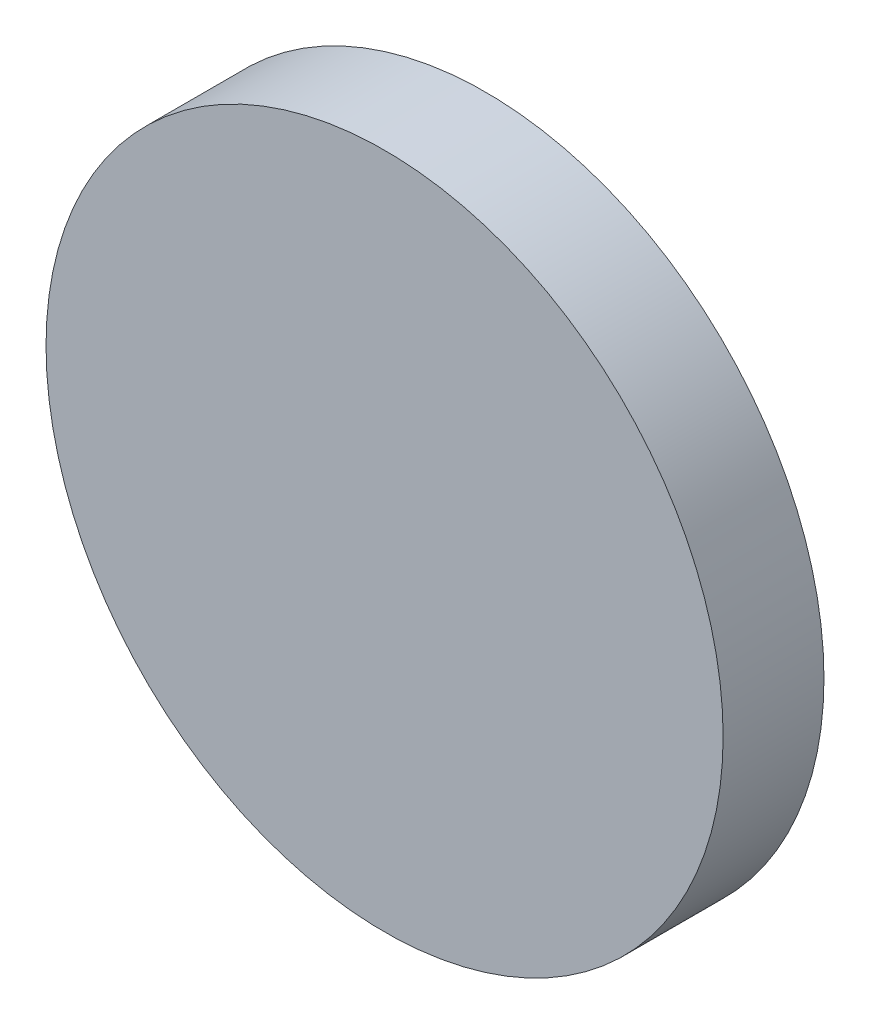
ISO-10303-21;
HEADER;
FILE_DESCRIPTION(('STEP AP214'),'2;1');
FILE_NAME('part.step','',(''),(''),'','','');
FILE_SCHEMA(('AUTOMOTIVE_DESIGN { 1 0 10303 214 1 1 1 1 }'));
ENDSEC;
DATA;
#1=APPLICATION_CONTEXT('core data for automotive mechanical design processes');
#2=APPLICATION_PROTOCOL_DEFINITION('international standard','automotive_design',2000,#1);
#3=PRODUCT_CONTEXT('',#1,'mechanical');
#4=PRODUCT('Part','Part','',(#3));
#5=PRODUCT_RELATED_PRODUCT_CATEGORY('part','',(#4));
#6=PRODUCT_DEFINITION_FORMATION('','',#4);
#7=PRODUCT_DEFINITION_CONTEXT('part definition',#1,'design');
#8=PRODUCT_DEFINITION('design','',#6,#7);
#9=PRODUCT_DEFINITION_SHAPE('','',#8);
#10=(LENGTH_UNIT() NAMED_UNIT(*) SI_UNIT(.MILLI.,.METRE.));
#11=(NAMED_UNIT(*) PLANE_ANGLE_UNIT() SI_UNIT($,.RADIAN.));
#12=(NAMED_UNIT(*) SI_UNIT($,.STERADIAN.) SOLID_ANGLE_UNIT());
#13=UNCERTAINTY_MEASURE_WITH_UNIT(LENGTH_MEASURE(1.E-05),#10,'distance_accuracy_value','');
#14=(GEOMETRIC_REPRESENTATION_CONTEXT(3) GLOBAL_UNCERTAINTY_ASSIGNED_CONTEXT((#13)) GLOBAL_UNIT_ASSIGNED_CONTEXT((#10,
#11,#12)) REPRESENTATION_CONTEXT('',''));
#15=CARTESIAN_POINT('',(0.,0.,0.));
#16=DIRECTION('',(0.,0.,1.));
#17=DIRECTION('',(1.,0.,0.));
#18=AXIS2_PLACEMENT_3D('',#15,#16,#17);
#19=CARTESIAN_POINT('',(0.,0.,8.4));
#20=DIRECTION('',(0.,0.,-1.));
#21=DIRECTION('',(-1.,0.,0.));
#22=AXIS2_PLACEMENT_3D('',#19,#20,#21);
#23=CYLINDRICAL_SURFACE('',#22,28.2);
#24=CARTESIAN_POINT('',(0.,0.,8.4));
#25=DIRECTION('',(0.,0.,1.));
#26=DIRECTION('',(1.,0.,0.));
#27=AXIS2_PLACEMENT_3D('',#24,#25,#26);
#28=CIRCLE('',#27,28.2);
#29=CARTESIAN_POINT('',(28.2,0.,8.4));
#30=VERTEX_POINT('',#29);
#31=EDGE_CURVE('E10',#30,#30,#28,.T.);
#32=ORIENTED_EDGE('',*,*,#31,.F.);
#33=EDGE_LOOP('',(#32));
#34=FACE_BOUND('',#33,.T.);
#35=CARTESIAN_POINT('',(0.,0.,0.));
#36=DIRECTION('',(0.,0.,1.));
#37=DIRECTION('',(1.,0.,0.));
#38=AXIS2_PLACEMENT_3D('',#35,#36,#37);
#39=CIRCLE('',#38,28.2);
#40=CARTESIAN_POINT('',(28.2,0.,0.));
#41=VERTEX_POINT('',#40);
#42=EDGE_CURVE('E31',#41,#41,#39,.T.);
#43=ORIENTED_EDGE('',*,*,#42,.T.);
#44=EDGE_LOOP('',(#43));
#45=FACE_BOUND('',#44,.T.);
#46=ADVANCED_FACE('F28',(#34,#45),#23,.T.);
#47=CARTESIAN_POINT('',(0.,0.,8.4));
#48=DIRECTION('',(0.,0.,1.));
#49=DIRECTION('',(1.,0.,0.));
#50=AXIS2_PLACEMENT_3D('',#47,#48,#49);
#51=PLANE('',#50);
#52=ORIENTED_EDGE('',*,*,#31,.T.);
#53=EDGE_LOOP('',(#52));
#54=FACE_BOUND('',#53,.T.);
#55=ADVANCED_FACE('F43',(#54),#51,.T.);
#56=CARTESIAN_POINT('',(0.,0.,0.));
#57=DIRECTION('',(0.,0.,1.));
#58=DIRECTION('',(1.,0.,0.));
#59=AXIS2_PLACEMENT_3D('',#56,#57,#58);
#60=PLANE('',#59);
#61=ORIENTED_EDGE('',*,*,#42,.F.);
#62=EDGE_LOOP('',(#61));
#63=FACE_BOUND('',#62,.T.);
#64=ADVANCED_FACE('F41',(#63),#60,.F.);
#65=CLOSED_SHELL('',(#46,#55,#64));
#66=MANIFOLD_SOLID_BREP('B2',#65);
#67=ADVANCED_BREP_SHAPE_REPRESENTATION('',(#18,#66),#14);
#68=SHAPE_DEFINITION_REPRESENTATION(#9,#67);
ENDSEC;
END-ISO-10303-21;
